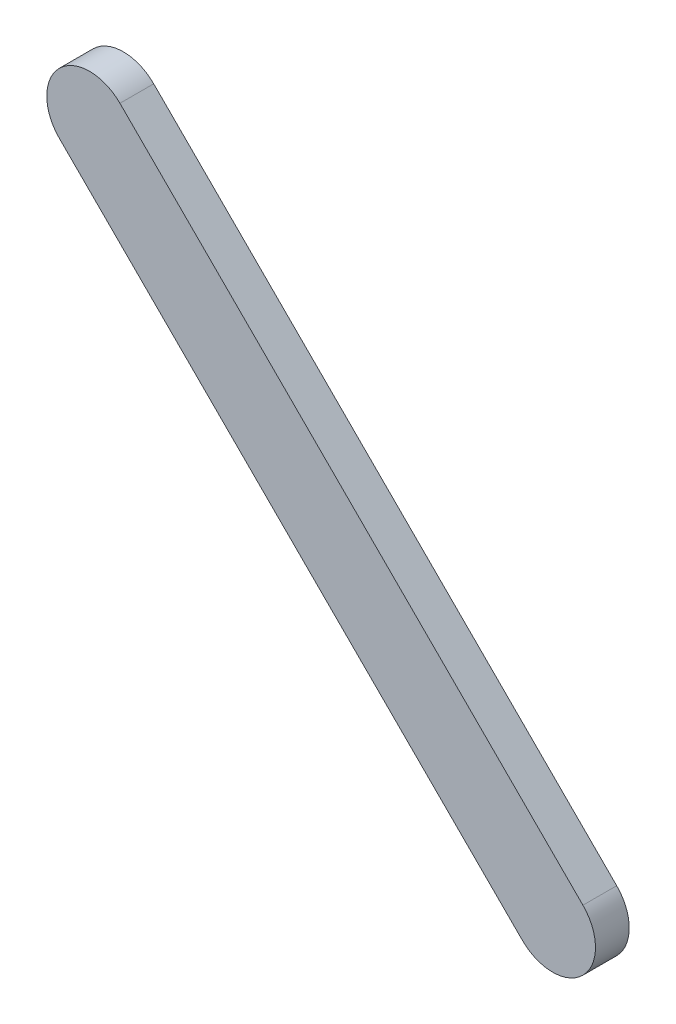
ISO-10303-21;
HEADER;
FILE_DESCRIPTION(('STEP AP214'),'2;1');
FILE_NAME('part.step','',(''),(''),'','','');
FILE_SCHEMA(('AUTOMOTIVE_DESIGN { 1 0 10303 214 1 1 1 1 }'));
ENDSEC;
DATA;
#1=APPLICATION_CONTEXT('core data for automotive mechanical design processes');
#2=APPLICATION_PROTOCOL_DEFINITION('international standard','automotive_design',2000,#1);
#3=PRODUCT_CONTEXT('',#1,'mechanical');
#4=PRODUCT('Part','Part','',(#3));
#5=PRODUCT_RELATED_PRODUCT_CATEGORY('part','',(#4));
#6=PRODUCT_DEFINITION_FORMATION('','',#4);
#7=PRODUCT_DEFINITION_CONTEXT('part definition',#1,'design');
#8=PRODUCT_DEFINITION('design','',#6,#7);
#9=PRODUCT_DEFINITION_SHAPE('','',#8);
#10=(LENGTH_UNIT() NAMED_UNIT(*) SI_UNIT(.MILLI.,.METRE.));
#11=(NAMED_UNIT(*) PLANE_ANGLE_UNIT() SI_UNIT($,.RADIAN.));
#12=(NAMED_UNIT(*) SI_UNIT($,.STERADIAN.) SOLID_ANGLE_UNIT());
#13=UNCERTAINTY_MEASURE_WITH_UNIT(LENGTH_MEASURE(1.E-05),#10,'distance_accuracy_value','');
#14=(GEOMETRIC_REPRESENTATION_CONTEXT(3) GLOBAL_UNCERTAINTY_ASSIGNED_CONTEXT((#13)) GLOBAL_UNIT_ASSIGNED_CONTEXT((#10,
#11,#12)) REPRESENTATION_CONTEXT('',''));
#15=CARTESIAN_POINT('',(0.,0.,0.));
#16=DIRECTION('',(0.,0.,1.));
#17=DIRECTION('',(1.,0.,0.));
#18=AXIS2_PLACEMENT_3D('',#15,#16,#17);
#19=CARTESIAN_POINT('',(131.1891966,74.64239326,0.));
#20=DIRECTION('',(0.707106781186549,0.707106781186546,0.));
#21=DIRECTION('',(0.707106781186546,-0.707106781186549,0.));
#22=AXIS2_PLACEMENT_3D('',#19,#20,#21);
#23=PLANE('',#22);
#24=DIRECTION('',(0.707106781186546,-0.707106781186549,0.));
#25=VECTOR('',#24,1.);
#26=CARTESIAN_POINT('',(131.1891966,74.64239326,0.1999996));
#27=LINE('',#26,#25);
#28=CARTESIAN_POINT('',(131.1891966,74.64239326,0.1999996));
#29=VERTEX_POINT('',#28);
#30=CARTESIAN_POINT('',(133.93239406,71.8991958,0.1999996));
#31=VERTEX_POINT('',#30);
#32=EDGE_CURVE('E11',#29,#31,#27,.T.);
#33=ORIENTED_EDGE('',*,*,#32,.F.);
#34=DIRECTION('',(0.,0.,1.));
#35=VECTOR('',#34,1.);
#36=CARTESIAN_POINT('',(131.1891966,74.64239326,0.));
#37=LINE('',#36,#35);
#38=CARTESIAN_POINT('',(131.1891966,74.64239326,0.));
#39=VERTEX_POINT('',#38);
#40=EDGE_CURVE('E24',#39,#29,#37,.T.);
#41=ORIENTED_EDGE('',*,*,#40,.F.);
#42=DIRECTION('',(0.707106781186546,-0.707106781186549,0.));
#43=VECTOR('',#42,1.);
#44=CARTESIAN_POINT('',(131.1891966,74.64239326,0.));
#45=LINE('',#44,#43);
#46=CARTESIAN_POINT('',(133.93239406,71.8991958,0.));
#47=VERTEX_POINT('',#46);
#48=EDGE_CURVE('E75',#39,#47,#45,.T.);
#49=ORIENTED_EDGE('',*,*,#48,.T.);
#50=DIRECTION('',(0.,0.,1.));
#51=VECTOR('',#50,1.);
#52=CARTESIAN_POINT('',(133.93239406,71.8991958,0.));
#53=LINE('',#52,#51);
#54=EDGE_CURVE('E37',#47,#31,#53,.T.);
#55=ORIENTED_EDGE('',*,*,#54,.T.);
#56=EDGE_LOOP('',(#33,#41,#49,#55));
#57=FACE_BOUND('',#56,.T.);
#58=ADVANCED_FACE('F17',(#57),#23,.F.);
#59=CARTESIAN_POINT('',(134.11199873,72.07880047,0.));
#60=DIRECTION('',(0.,0.,-1.));
#61=DIRECTION('',(-0.707106781186548,-0.707106781186548,0.));
#62=AXIS2_PLACEMENT_3D('',#59,#60,#61);
#63=CYLINDRICAL_SURFACE('',#62,0.253999360179546);
#64=CARTESIAN_POINT('',(134.11199873,72.07880047,0.1999996));
#65=DIRECTION('',(0.,0.,1.));
#66=DIRECTION('',(-0.707106781186548,-0.707106781186548,0.));
#67=AXIS2_PLACEMENT_3D('',#64,#65,#66);
#68=CIRCLE('',#67,0.253999360179546);
#69=CARTESIAN_POINT('',(134.2916034,72.25840514,0.1999996));
#70=VERTEX_POINT('',#69);
#71=EDGE_CURVE('E83',#31,#70,#68,.T.);
#72=ORIENTED_EDGE('',*,*,#71,.F.);
#73=ORIENTED_EDGE('',*,*,#54,.F.);
#74=CARTESIAN_POINT('',(134.11199873,72.07880047,0.));
#75=DIRECTION('',(0.,0.,1.));
#76=DIRECTION('',(-0.707106781186548,-0.707106781186548,0.));
#77=AXIS2_PLACEMENT_3D('',#74,#75,#76);
#78=CIRCLE('',#77,0.253999360179546);
#79=CARTESIAN_POINT('',(134.2916034,72.25840514,0.));
#80=VERTEX_POINT('',#79);
#81=EDGE_CURVE('E81',#47,#80,#78,.T.);
#82=ORIENTED_EDGE('',*,*,#81,.T.);
#83=DIRECTION('',(0.,0.,1.));
#84=VECTOR('',#83,1.);
#85=CARTESIAN_POINT('',(134.2916034,72.25840514,0.));
#86=LINE('',#85,#84);
#87=EDGE_CURVE('E67',#80,#70,#86,.T.);
#88=ORIENTED_EDGE('',*,*,#87,.T.);
#89=EDGE_LOOP('',(#72,#73,#82,#88));
#90=FACE_BOUND('',#89,.T.);
#91=ADVANCED_FACE('F89',(#90),#63,.T.);
#92=CARTESIAN_POINT('',(134.2916034,72.25840514,0.));
#93=DIRECTION('',(-0.707106781186548,-0.707106781186548,0.));
#94=DIRECTION('',(-0.707106781186548,0.707106781186548,0.));
#95=AXIS2_PLACEMENT_3D('',#92,#93,#94);
#96=PLANE('',#95);
#97=DIRECTION('',(-0.707106781186548,0.707106781186548,0.));
#98=VECTOR('',#97,1.);
#99=CARTESIAN_POINT('',(134.2916034,72.25840514,0.1999996));
#100=LINE('',#99,#98);
#101=CARTESIAN_POINT('',(131.54840594,75.0016026,0.1999996));
#102=VERTEX_POINT('',#101);
#103=EDGE_CURVE('E71',#70,#102,#100,.T.);
#104=ORIENTED_EDGE('',*,*,#103,.F.);
#105=ORIENTED_EDGE('',*,*,#87,.F.);
#106=DIRECTION('',(-0.707106781186548,0.707106781186548,0.));
#107=VECTOR('',#106,1.);
#108=CARTESIAN_POINT('',(134.2916034,72.25840514,0.));
#109=LINE('',#108,#107);
#110=CARTESIAN_POINT('',(131.54840594,75.0016026,0.));
#111=VERTEX_POINT('',#110);
#112=EDGE_CURVE('E63',#80,#111,#109,.T.);
#113=ORIENTED_EDGE('',*,*,#112,.T.);
#114=DIRECTION('',(0.,0.,1.));
#115=VECTOR('',#114,1.);
#116=CARTESIAN_POINT('',(131.54840594,75.0016026,0.));
#117=LINE('',#116,#115);
#118=EDGE_CURVE('E53',#111,#102,#117,.T.);
#119=ORIENTED_EDGE('',*,*,#118,.T.);
#120=EDGE_LOOP('',(#104,#105,#113,#119));
#121=FACE_BOUND('',#120,.T.);
#122=ADVANCED_FACE('F66',(#121),#96,.F.);
#123=CARTESIAN_POINT('',(131.36880127,74.82199793,0.));
#124=DIRECTION('',(0.,0.,-1.));
#125=DIRECTION('',(0.707106781186492,0.707106781186603,0.));
#126=AXIS2_PLACEMENT_3D('',#123,#124,#125);
#127=CYLINDRICAL_SURFACE('',#126,0.253999360179542);
#128=CARTESIAN_POINT('',(131.36880127,74.82199793,0.1999996));
#129=DIRECTION('',(0.,0.,1.));
#130=DIRECTION('',(0.707106781186492,0.707106781186603,0.));
#131=AXIS2_PLACEMENT_3D('',#128,#129,#130);
#132=CIRCLE('',#131,0.253999360179542);
#133=EDGE_CURVE('E59',#102,#29,#132,.T.);
#134=ORIENTED_EDGE('',*,*,#133,.F.);
#135=ORIENTED_EDGE('',*,*,#118,.F.);
#136=CARTESIAN_POINT('',(131.36880127,74.82199793,0.));
#137=DIRECTION('',(0.,0.,1.));
#138=DIRECTION('',(0.707106781186492,0.707106781186603,0.));
#139=AXIS2_PLACEMENT_3D('',#136,#137,#138);
#140=CIRCLE('',#139,0.253999360179542);
#141=EDGE_CURVE('E57',#111,#39,#140,.T.);
#142=ORIENTED_EDGE('',*,*,#141,.T.);
#143=ORIENTED_EDGE('',*,*,#40,.T.);
#144=EDGE_LOOP('',(#134,#135,#142,#143));
#145=FACE_BOUND('',#144,.T.);
#146=ADVANCED_FACE('F55',(#145),#127,.T.);
#147=CARTESIAN_POINT('',(131.1891966,74.64239326,0.));
#148=DIRECTION('',(0.,0.,-1.));
#149=DIRECTION('',(-1.,0.,0.));
#150=AXIS2_PLACEMENT_3D('',#147,#148,#149);
#151=PLANE('',#150);
#152=ORIENTED_EDGE('',*,*,#141,.F.);
#153=ORIENTED_EDGE('',*,*,#112,.F.);
#154=ORIENTED_EDGE('',*,*,#81,.F.);
#155=ORIENTED_EDGE('',*,*,#48,.F.);
#156=EDGE_LOOP('',(#152,#153,#154,#155));
#157=FACE_BOUND('',#156,.T.);
#158=ADVANCED_FACE('F74',(#157),#151,.T.);
#159=CARTESIAN_POINT('',(131.1891966,74.64239326,0.1999996));
#160=DIRECTION('',(0.,0.,-1.));
#161=DIRECTION('',(-1.,0.,0.));
#162=AXIS2_PLACEMENT_3D('',#159,#160,#161);
#163=PLANE('',#162);
#164=ORIENTED_EDGE('',*,*,#32,.T.);
#165=ORIENTED_EDGE('',*,*,#71,.T.);
#166=ORIENTED_EDGE('',*,*,#103,.T.);
#167=ORIENTED_EDGE('',*,*,#133,.T.);
#168=EDGE_LOOP('',(#164,#165,#166,#167));
#169=FACE_BOUND('',#168,.T.);
#170=ADVANCED_FACE('F91',(#169),#163,.F.);
#171=CLOSED_SHELL('',(#58,#91,#122,#146,#158,#170));
#172=MANIFOLD_SOLID_BREP('B1',#171);
#173=ADVANCED_BREP_SHAPE_REPRESENTATION('',(#18,#172),#14);
#174=SHAPE_DEFINITION_REPRESENTATION(#9,#173);
ENDSEC;
END-ISO-10303-21;
